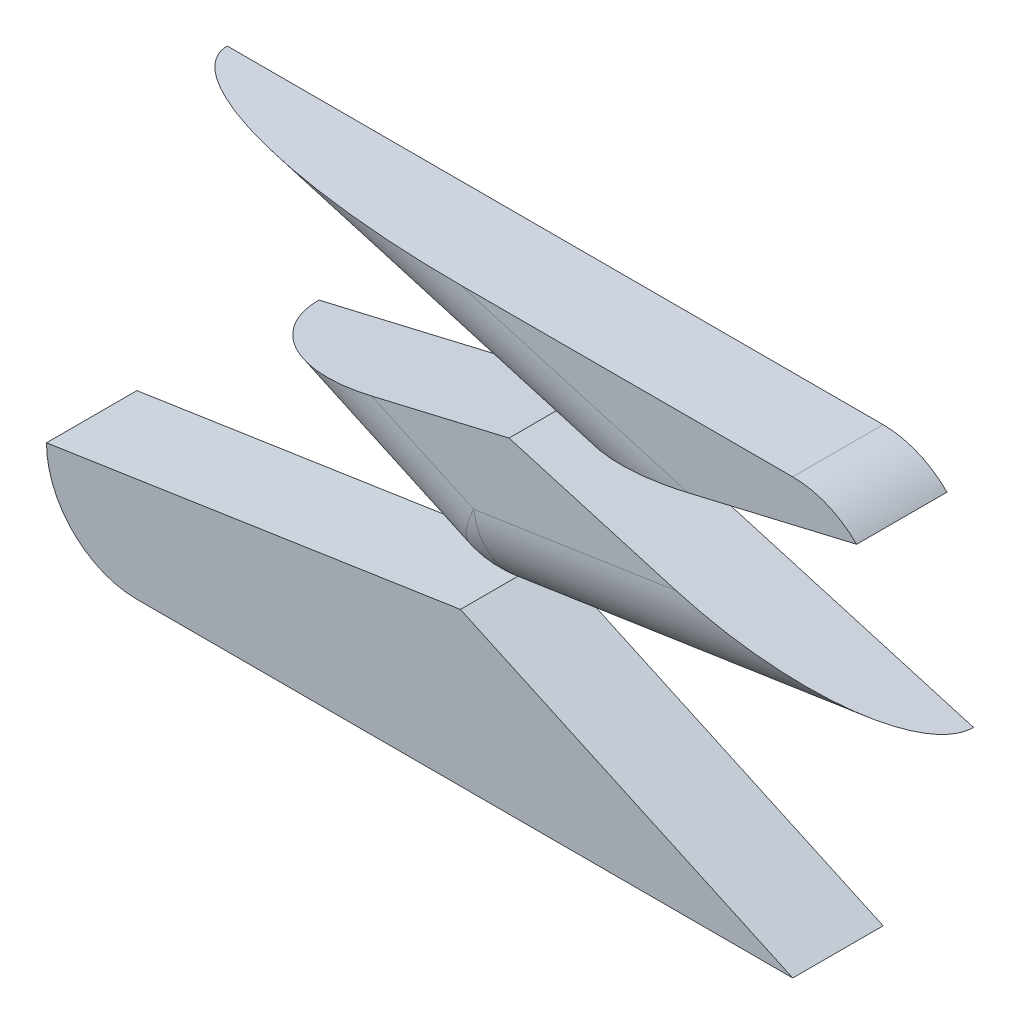
ISO-10303-21;
HEADER;
FILE_DESCRIPTION(('STEP AP214'),'2;1');
FILE_NAME('part.step','',(''),(''),'','','');
FILE_SCHEMA(('AUTOMOTIVE_DESIGN { 1 0 10303 214 1 1 1 1 }'));
ENDSEC;
DATA;
#1=APPLICATION_CONTEXT('core data for automotive mechanical design processes');
#2=APPLICATION_PROTOCOL_DEFINITION('international standard','automotive_design',2000,#1);
#3=PRODUCT_CONTEXT('',#1,'mechanical');
#4=PRODUCT('Part','Part','',(#3));
#5=PRODUCT_RELATED_PRODUCT_CATEGORY('part','',(#4));
#6=PRODUCT_DEFINITION_FORMATION('','',#4);
#7=PRODUCT_DEFINITION_CONTEXT('part definition',#1,'design');
#8=PRODUCT_DEFINITION('design','',#6,#7);
#9=PRODUCT_DEFINITION_SHAPE('','',#8);
#10=(LENGTH_UNIT() NAMED_UNIT(*) SI_UNIT(.MILLI.,.METRE.));
#11=(NAMED_UNIT(*) PLANE_ANGLE_UNIT() SI_UNIT($,.RADIAN.));
#12=(NAMED_UNIT(*) SI_UNIT($,.STERADIAN.) SOLID_ANGLE_UNIT());
#13=UNCERTAINTY_MEASURE_WITH_UNIT(LENGTH_MEASURE(1.E-05),#10,'distance_accuracy_value','');
#14=(GEOMETRIC_REPRESENTATION_CONTEXT(3) GLOBAL_UNCERTAINTY_ASSIGNED_CONTEXT((#13)) GLOBAL_UNIT_ASSIGNED_CONTEXT((#10,
#11,#12)) REPRESENTATION_CONTEXT('',''));
#15=CARTESIAN_POINT('',(0.,0.,0.));
#16=DIRECTION('',(0.,0.,1.));
#17=DIRECTION('',(1.,0.,0.));
#18=AXIS2_PLACEMENT_3D('',#15,#16,#17);
#19=CARTESIAN_POINT('',(14.0864731957978,11.838912938109,10.));
#20=DIRECTION('',(0.,0.,-1.));
#21=DIRECTION('',(-1.,0.,0.));
#22=AXIS2_PLACEMENT_3D('',#19,#20,#21);
#23=CYLINDRICAL_SURFACE('',#22,10.);
#24=CARTESIAN_POINT('',(14.0864731957978,11.838912938109,0.));
#25=DIRECTION('',(0.,0.,1.));
#26=DIRECTION('',(1.,0.,0.));
#27=AXIS2_PLACEMENT_3D('',#24,#25,#26);
#28=CIRCLE('',#27,10.);
#29=CARTESIAN_POINT('',(14.0864731957979,1.83891293810901,0.));
#30=VERTEX_POINT('',#29);
#31=CARTESIAN_POINT('',(4.0864731957978,11.8389129381091,0.));
#32=VERTEX_POINT('',#31);
#33=EDGE_CURVE('E119',#30,#32,#28,.F.);
#34=ORIENTED_EDGE('',*,*,#33,.F.);
#35=DIRECTION('',(0.,0.,-1.));
#36=VECTOR('',#35,1.);
#37=CARTESIAN_POINT('',(14.0864731957979,1.83891293810901,10.));
#38=LINE('',#37,#36);
#39=CARTESIAN_POINT('',(14.0864731957979,1.83891293810901,10.));
#40=VERTEX_POINT('',#39);
#41=EDGE_CURVE('E12',#40,#30,#38,.T.);
#42=ORIENTED_EDGE('',*,*,#41,.F.);
#43=CARTESIAN_POINT('',(14.0864731957978,11.838912938109,10.));
#44=DIRECTION('',(0.,0.,1.));
#45=DIRECTION('',(1.,0.,0.));
#46=AXIS2_PLACEMENT_3D('',#43,#44,#45);
#47=CIRCLE('',#46,10.);
#48=CARTESIAN_POINT('',(4.0864731957978,11.8389129381091,10.));
#49=VERTEX_POINT('',#48);
#50=EDGE_CURVE('E105',#40,#49,#47,.F.);
#51=ORIENTED_EDGE('',*,*,#50,.T.);
#52=DIRECTION('',(0.,0.,-1.));
#53=VECTOR('',#52,1.);
#54=CARTESIAN_POINT('',(4.0864731957978,11.8389129381091,10.));
#55=LINE('',#54,#53);
#56=EDGE_CURVE('E69',#49,#32,#55,.T.);
#57=ORIENTED_EDGE('',*,*,#56,.T.);
#58=EDGE_LOOP('',(#34,#42,#51,#57));
#59=FACE_BOUND('',#58,.T.);
#60=ADVANCED_FACE('F53',(#59),#23,.T.);
#61=CARTESIAN_POINT('',(0.,1.83891293810901,10.));
#62=DIRECTION('',(0.,1.,0.));
#63=DIRECTION('',(0.,0.,1.));
#64=AXIS2_PLACEMENT_3D('',#61,#62,#63);
#65=PLANE('',#64);
#66=DIRECTION('',(1.,0.,0.));
#67=VECTOR('',#66,1.);
#68=CARTESIAN_POINT('',(0.,1.83891293810901,0.));
#69=LINE('',#68,#67);
#70=CARTESIAN_POINT('',(86.6450910806178,1.83891293810901,0.));
#71=VERTEX_POINT('',#70);
#72=EDGE_CURVE('E107',#30,#71,#69,.T.);
#73=ORIENTED_EDGE('',*,*,#72,.T.);
#74=DIRECTION('',(0.,0.,-1.));
#75=VECTOR('',#74,1.);
#76=CARTESIAN_POINT('',(86.6450910806178,1.83891293810901,10.));
#77=LINE('',#76,#75);
#78=CARTESIAN_POINT('',(86.6450910806178,1.83891293810901,10.));
#79=VERTEX_POINT('',#78);
#80=EDGE_CURVE('E64',#79,#71,#77,.T.);
#81=ORIENTED_EDGE('',*,*,#80,.F.);
#82=DIRECTION('',(1.,0.,0.));
#83=VECTOR('',#82,1.);
#84=CARTESIAN_POINT('',(0.,1.83891293810901,10.));
#85=LINE('',#84,#83);
#86=EDGE_CURVE('E96',#40,#79,#85,.T.);
#87=ORIENTED_EDGE('',*,*,#86,.F.);
#88=ORIENTED_EDGE('',*,*,#41,.T.);
#89=EDGE_LOOP('',(#73,#81,#87,#88));
#90=FACE_BOUND('',#89,.T.);
#91=ADVANCED_FACE('F106',(#90),#65,.F.);
#92=CARTESIAN_POINT('',(15.8564941028141,34.4351896510022,10.));
#93=DIRECTION('',(0.418260594793118,0.908327074815733,0.));
#94=DIRECTION('',(-0.908327074815733,0.418260594793118,0.));
#95=AXIS2_PLACEMENT_3D('',#92,#93,#94);
#96=PLANE('',#95);
#97=DIRECTION('',(0.908327074815734,-0.418260594793118,0.));
#98=VECTOR('',#97,1.);
#99=CARTESIAN_POINT('',(15.8564941028141,34.4351896510022,0.));
#100=LINE('',#99,#98);
#101=CARTESIAN_POINT('',(49.8781308796075,18.7691257092401,0.));
#102=VERTEX_POINT('',#101);
#103=EDGE_CURVE('E118',#102,#71,#100,.T.);
#104=ORIENTED_EDGE('',*,*,#103,.F.);
#105=DIRECTION('',(0.,0.,-1.));
#106=VECTOR('',#105,1.);
#107=CARTESIAN_POINT('',(49.8781308796075,18.7691257092401,10.));
#108=LINE('',#107,#106);
#109=CARTESIAN_POINT('',(49.8781308796075,18.7691257092401,10.));
#110=VERTEX_POINT('',#109);
#111=EDGE_CURVE('E82',#110,#102,#108,.T.);
#112=ORIENTED_EDGE('',*,*,#111,.F.);
#113=DIRECTION('',(0.908327074815734,-0.418260594793118,0.));
#114=VECTOR('',#113,1.);
#115=CARTESIAN_POINT('',(15.8564941028141,34.4351896510022,10.));
#116=LINE('',#115,#114);
#117=EDGE_CURVE('E101',#110,#79,#116,.T.);
#118=ORIENTED_EDGE('',*,*,#117,.T.);
#119=ORIENTED_EDGE('',*,*,#80,.T.);
#120=EDGE_LOOP('',(#104,#112,#118,#119));
#121=FACE_BOUND('',#120,.T.);
#122=ADVANCED_FACE('F112',(#121),#96,.T.);
#123=CARTESIAN_POINT('',(-1.66010540498889,10.9692127694786,10.));
#124=DIRECTION('',(-0.149638264627068,0.988740810202249,0.));
#125=DIRECTION('',(-0.988740810202249,-0.149638264627068,0.));
#126=AXIS2_PLACEMENT_3D('',#123,#124,#125);
#127=PLANE('',#126);
#128=DIRECTION('',(0.988740810202249,0.149638264627068,0.));
#129=VECTOR('',#128,1.);
#130=CARTESIAN_POINT('',(-1.66010540498889,10.9692127694786,0.));
#131=LINE('',#130,#129);
#132=EDGE_CURVE('E125',#32,#102,#131,.T.);
#133=ORIENTED_EDGE('',*,*,#132,.F.);
#134=ORIENTED_EDGE('',*,*,#56,.F.);
#135=DIRECTION('',(0.988740810202249,0.149638264627068,0.));
#136=VECTOR('',#135,1.);
#137=CARTESIAN_POINT('',(-1.66010540498889,10.9692127694786,10.));
#138=LINE('',#137,#136);
#139=EDGE_CURVE('E115',#49,#110,#138,.T.);
#140=ORIENTED_EDGE('',*,*,#139,.T.);
#141=ORIENTED_EDGE('',*,*,#111,.T.);
#142=EDGE_LOOP('',(#133,#134,#140,#141));
#143=FACE_BOUND('',#142,.T.);
#144=ADVANCED_FACE('F130',(#143),#127,.T.);
#145=CARTESIAN_POINT('',(0.,0.,10.));
#146=DIRECTION('',(0.,0.,1.));
#147=DIRECTION('',(1.,0.,0.));
#148=AXIS2_PLACEMENT_3D('',#145,#146,#147);
#149=PLANE('',#148);
#150=ORIENTED_EDGE('',*,*,#50,.F.);
#151=ORIENTED_EDGE('',*,*,#86,.T.);
#152=ORIENTED_EDGE('',*,*,#117,.F.);
#153=ORIENTED_EDGE('',*,*,#139,.F.);
#154=EDGE_LOOP('',(#150,#151,#152,#153));
#155=FACE_BOUND('',#154,.T.);
#156=ADVANCED_FACE('F98',(#155),#149,.T.);
#157=CARTESIAN_POINT('',(0.,0.,0.));
#158=DIRECTION('',(0.,0.,1.));
#159=DIRECTION('',(1.,0.,0.));
#160=AXIS2_PLACEMENT_3D('',#157,#158,#159);
#161=PLANE('',#160);
#162=ORIENTED_EDGE('',*,*,#33,.T.);
#163=ORIENTED_EDGE('',*,*,#132,.T.);
#164=ORIENTED_EDGE('',*,*,#103,.T.);
#165=ORIENTED_EDGE('',*,*,#72,.F.);
#166=EDGE_LOOP('',(#162,#163,#164,#165));
#167=FACE_BOUND('',#166,.T.);
#168=ADVANCED_FACE('F131',(#167),#161,.F.);
#169=CLOSED_SHELL('',(#60,#91,#122,#144,#156,#168));
#170=MANIFOLD_SOLID_BREP('B2',#169);
#171=CARTESIAN_POINT('',(86.6450910806178,39.8549729887331,10.));
#172=DIRECTION('',(0.,0.,-1.));
#173=DIRECTION('',(-1.,0.,0.));
#174=AXIS2_PLACEMENT_3D('',#171,#172,#173);
#175=CYLINDRICAL_SURFACE('',#174,10.);
#176=CARTESIAN_POINT('',(86.6450910806178,39.8549729887331,0.));
#177=DIRECTION('',(0.,0.,1.));
#178=DIRECTION('',(1.,0.,0.));
#179=AXIS2_PLACEMENT_3D('',#176,#177,#178);
#180=CIRCLE('',#179,10.);
#181=CARTESIAN_POINT('',(86.6450910806178,49.8549729887331,0.));
#182=VERTEX_POINT('',#181);
#183=CARTESIAN_POINT('',(93.7161588924833,46.9260408005986,0.));
#184=VERTEX_POINT('',#183);
#185=EDGE_CURVE('E240',#182,#184,#180,.F.);
#186=ORIENTED_EDGE('',*,*,#185,.F.);
#187=DIRECTION('',(0.,0.,-1.));
#188=VECTOR('',#187,1.);
#189=CARTESIAN_POINT('',(86.6450910806178,49.8549729887331,10.));
#190=LINE('',#189,#188);
#191=CARTESIAN_POINT('',(86.6450910806178,49.8549729887331,10.));
#192=VERTEX_POINT('',#191);
#193=EDGE_CURVE('E229',#192,#182,#190,.T.);
#194=ORIENTED_EDGE('',*,*,#193,.F.);
#195=CARTESIAN_POINT('',(86.6450910806178,39.8549729887331,10.));
#196=DIRECTION('',(0.,0.,1.));
#197=DIRECTION('',(1.,0.,0.));
#198=AXIS2_PLACEMENT_3D('',#195,#196,#197);
#199=CIRCLE('',#198,10.);
#200=CARTESIAN_POINT('',(93.7161588924833,46.9260408005986,10.));
#201=VERTEX_POINT('',#200);
#202=EDGE_CURVE('E235',#192,#201,#199,.F.);
#203=ORIENTED_EDGE('',*,*,#202,.T.);
#204=DIRECTION('',(0.,0.,-1.));
#205=VECTOR('',#204,1.);
#206=CARTESIAN_POINT('',(93.7161588924833,46.9260408005986,10.));
#207=LINE('',#206,#205);
#208=EDGE_CURVE('E238',#201,#184,#207,.T.);
#209=ORIENTED_EDGE('',*,*,#208,.T.);
#210=EDGE_LOOP('',(#186,#194,#203,#209));
#211=FACE_BOUND('',#210,.T.);
#212=ADVANCED_FACE('F189',(#211),#175,.T.);
#213=CARTESIAN_POINT('',(0.,49.8549729887331,10.));
#214=DIRECTION('',(0.,1.,0.));
#215=DIRECTION('',(0.,0.,1.));
#216=AXIS2_PLACEMENT_3D('',#213,#214,#215);
#217=PLANE('',#216);
#218=DIRECTION('',(1.,0.,0.));
#219=VECTOR('',#218,1.);
#220=CARTESIAN_POINT('',(0.,49.8549729887331,0.));
#221=LINE('',#220,#219);
#222=CARTESIAN_POINT('',(14.0864731957979,49.8549729887331,0.));
#223=VERTEX_POINT('',#222);
#224=EDGE_CURVE('E251',#223,#182,#221,.T.);
#225=ORIENTED_EDGE('',*,*,#224,.F.);
#226=CARTESIAN_POINT('',(49.8988863492792,49.8549729887331,0.));
#227=DIRECTION('',(0.,1.,0.));
#228=DIRECTION('',(-1.,0.,0.));
#229=AXIS2_PLACEMENT_3D('',#226,#227,#228);
#230=ELLIPSE('',#229,35.8124131534813,10.);
#231=CARTESIAN_POINT('',(49.8988863492792,49.8549729887331,10.));
#232=VERTEX_POINT('',#231);
#233=EDGE_CURVE('E55',#223,#232,#230,.T.);
#234=ORIENTED_EDGE('',*,*,#233,.T.);
#235=DIRECTION('',(1.,0.,0.));
#236=VECTOR('',#235,1.);
#237=CARTESIAN_POINT('',(0.,49.8549729887331,10.));
#238=LINE('',#237,#236);
#239=EDGE_CURVE('E221',#232,#192,#238,.T.);
#240=ORIENTED_EDGE('',*,*,#239,.T.);
#241=ORIENTED_EDGE('',*,*,#193,.T.);
#242=EDGE_LOOP('',(#225,#234,#240,#241));
#243=FACE_BOUND('',#242,.T.);
#244=ADVANCED_FACE('F227',(#243),#217,.T.);
#245=CARTESIAN_POINT('',(-5.54591729924884,23.5815986182663,10.));
#246=DIRECTION('',(-0.228933953149476,0.973441957743426,0.));
#247=DIRECTION('',(-0.973441957743426,-0.228933953149476,0.));
#248=AXIS2_PLACEMENT_3D('',#245,#246,#247);
#249=PLANE('',#248);
#250=DIRECTION('',(0.973441957743426,0.228933953149476,0.));
#251=VECTOR('',#250,1.);
#252=CARTESIAN_POINT('',(-5.54591729924884,23.5815986182663,10.));
#253=LINE('',#252,#251);
#254=CARTESIAN_POINT('',(75.0593122475362,42.5383260305957,10.));
#255=VERTEX_POINT('',#254);
#256=EDGE_CURVE('E231',#255,#201,#253,.T.);
#257=ORIENTED_EDGE('',*,*,#256,.F.);
#258=CARTESIAN_POINT('',(75.0593122475362,42.5383260305957,0.));
#259=DIRECTION('',(-0.228933953149476,0.973441957743426,0.));
#260=DIRECTION('',(-0.973441957743426,-0.228933953149476,0.));
#261=AXIS2_PLACEMENT_3D('',#258,#259,#260);
#262=ELLIPSE('',#261,20.3398934483914,10.);
#263=CARTESIAN_POINT('',(55.2596065488413,37.8818338168163,0.));
#264=VERTEX_POINT('',#263);
#265=EDGE_CURVE('E194',#255,#264,#262,.F.);
#266=ORIENTED_EDGE('',*,*,#265,.T.);
#267=DIRECTION('',(0.973441957743426,0.228933953149476,0.));
#268=VECTOR('',#267,1.);
#269=CARTESIAN_POINT('',(-5.54591729924884,23.5815986182663,0.));
#270=LINE('',#269,#268);
#271=EDGE_CURVE('E243',#264,#184,#270,.T.);
#272=ORIENTED_EDGE('',*,*,#271,.T.);
#273=ORIENTED_EDGE('',*,*,#208,.F.);
#274=EDGE_LOOP('',(#257,#266,#272,#273));
#275=FACE_BOUND('',#274,.T.);
#276=ADVANCED_FACE('F259',(#275),#249,.F.);
#277=CARTESIAN_POINT('',(0.,0.,10.));
#278=DIRECTION('',(0.,0.,1.));
#279=DIRECTION('',(1.,0.,0.));
#280=AXIS2_PLACEMENT_3D('',#277,#278,#279);
#281=PLANE('',#280);
#282=ORIENTED_EDGE('',*,*,#239,.F.);
#283=DIRECTION('',(0.960223437349689,-0.279232788841762,0.));
#284=VECTOR('',#283,1.);
#285=CARTESIAN_POINT('',(58.051934437259,47.4840681903132,10.));
#286=LINE('',#285,#284);
#287=EDGE_CURVE('E239',#232,#255,#286,.T.);
#288=ORIENTED_EDGE('',*,*,#287,.T.);
#289=ORIENTED_EDGE('',*,*,#256,.T.);
#290=ORIENTED_EDGE('',*,*,#202,.F.);
#291=EDGE_LOOP('',(#282,#288,#289,#290));
#292=FACE_BOUND('',#291,.T.);
#293=ADVANCED_FACE('F244',(#292),#281,.T.);
#294=CARTESIAN_POINT('',(0.,0.,0.));
#295=DIRECTION('',(0.,0.,1.));
#296=DIRECTION('',(1.,0.,0.));
#297=AXIS2_PLACEMENT_3D('',#294,#295,#296);
#298=PLANE('',#297);
#299=ORIENTED_EDGE('',*,*,#185,.T.);
#300=ORIENTED_EDGE('',*,*,#271,.F.);
#301=DIRECTION('',(0.960223437349689,-0.279232788841762,0.));
#302=VECTOR('',#301,1.);
#303=CARTESIAN_POINT('',(14.465743625151,49.7446812216359,0.));
#304=LINE('',#303,#302);
#305=EDGE_CURVE('E247',#223,#264,#304,.T.);
#306=ORIENTED_EDGE('',*,*,#305,.F.);
#307=ORIENTED_EDGE('',*,*,#224,.T.);
#308=EDGE_LOOP('',(#299,#300,#306,#307));
#309=FACE_BOUND('',#308,.T.);
#310=ADVANCED_FACE('F261',(#309),#298,.F.);
#311=CARTESIAN_POINT('',(17.2580715135686,59.3469155951327,0.));
#312=DIRECTION('',(-0.960223437349689,0.279232788841762,0.));
#313=DIRECTION('',(-0.279232788841762,-0.960223437349689,0.));
#314=AXIS2_PLACEMENT_3D('',#311,#312,#313);
#315=CYLINDRICAL_SURFACE('',#314,10.);
#316=ORIENTED_EDGE('',*,*,#233,.F.);
#317=ORIENTED_EDGE('',*,*,#305,.T.);
#318=ORIENTED_EDGE('',*,*,#265,.F.);
#319=ORIENTED_EDGE('',*,*,#287,.F.);
#320=EDGE_LOOP('',(#316,#317,#318,#319));
#321=FACE_BOUND('',#320,.T.);
#322=ADVANCED_FACE('F186',(#321),#315,.T.);
#323=CLOSED_SHELL('',(#212,#244,#276,#293,#310,#322));
#324=MANIFOLD_SOLID_BREP('B6',#323);
#325=CARTESIAN_POINT('',(-5.54591729924884,23.5815986182663,10.));
#326=DIRECTION('',(-0.228933953149476,0.973441957743426,0.));
#327=DIRECTION('',(-0.973441957743426,-0.228933953149476,0.));
#328=AXIS2_PLACEMENT_3D('',#325,#326,#327);
#329=PLANE('',#328);
#330=DIRECTION('',(0.973441957743426,0.228933953149476,0.));
#331=VECTOR('',#330,1.);
#332=CARTESIAN_POINT('',(-5.54591729924884,23.5815986182663,0.));
#333=LINE('',#332,#331);
#334=CARTESIAN_POINT('',(24.222980218786,30.5826440688895,0.));
#335=VERTEX_POINT('',#334);
#336=CARTESIAN_POINT('',(55.2596065488413,37.8818338168163,0.));
#337=VERTEX_POINT('',#336);
#338=EDGE_CURVE('E374',#335,#337,#333,.T.);
#339=ORIENTED_EDGE('',*,*,#338,.F.);
#340=CARTESIAN_POINT('',(40.0487489316388,34.3045462986448,0.));
#341=DIRECTION('',(-0.228933953149476,0.973441957743426,0.));
#342=DIRECTION('',(-0.973441957743426,-0.228933953149476,0.));
#343=AXIS2_PLACEMENT_3D('',#340,#341,#342);
#344=ELLIPSE('',#343,16.2575370693279,10.);
#345=CARTESIAN_POINT('',(40.0487489316388,34.3045462986448,10.));
#346=VERTEX_POINT('',#345);
#347=EDGE_CURVE('E183',#335,#346,#344,.T.);
#348=ORIENTED_EDGE('',*,*,#347,.T.);
#349=DIRECTION('',(0.973441957743426,0.228933953149476,0.));
#350=VECTOR('',#349,1.);
#351=CARTESIAN_POINT('',(-5.54591729924884,23.5815986182663,10.));
#352=LINE('',#351,#350);
#353=CARTESIAN_POINT('',(55.2596065488413,37.8818338168163,10.));
#354=VERTEX_POINT('',#353);
#355=EDGE_CURVE('E354',#346,#354,#352,.T.);
#356=ORIENTED_EDGE('',*,*,#355,.T.);
#357=DIRECTION('',(0.,0.,-1.));
#358=VECTOR('',#357,1.);
#359=CARTESIAN_POINT('',(55.2596065488413,37.8818338168163,10.));
#360=LINE('',#359,#358);
#361=EDGE_CURVE('E351',#354,#337,#360,.T.);
#362=ORIENTED_EDGE('',*,*,#361,.T.);
#363=EDGE_LOOP('',(#339,#348,#356,#362));
#364=FACE_BOUND('',#363,.T.);
#365=ADVANCED_FACE('F313',(#364),#329,.T.);
#366=CARTESIAN_POINT('',(14.465743625151,49.7446812216359,10.));
#367=DIRECTION('',(0.279232788841762,0.960223437349689,0.));
#368=DIRECTION('',(-0.960223437349689,0.279232788841762,0.));
#369=AXIS2_PLACEMENT_3D('',#366,#367,#368);
#370=PLANE('',#369);
#371=DIRECTION('',(0.960223437349689,-0.279232788841762,0.));
#372=VECTOR('',#371,1.);
#373=CARTESIAN_POINT('',(14.465743625151,49.7446812216359,10.));
#374=LINE('',#373,#372);
#375=CARTESIAN_POINT('',(73.7703752104842,32.4989058898938,10.));
#376=VERTEX_POINT('',#375);
#377=EDGE_CURVE('E358',#354,#376,#374,.T.);
#378=ORIENTED_EDGE('',*,*,#377,.T.);
#379=CARTESIAN_POINT('',(73.7703752104842,32.4989058898938,0.));
#380=DIRECTION('',(0.279232788841762,0.960223437349689,0.));
#381=DIRECTION('',(-0.960223437349689,0.279232788841762,0.));
#382=AXIS2_PLACEMENT_3D('',#379,#380,#381);
#383=ELLIPSE('',#382,23.8222844604482,10.);
#384=CARTESIAN_POINT('',(96.6450910806178,25.846942963421,0.));
#385=VERTEX_POINT('',#384);
#386=EDGE_CURVE('E382',#376,#385,#383,.T.);
#387=ORIENTED_EDGE('',*,*,#386,.T.);
#388=DIRECTION('',(0.960223437349689,-0.279232788841762,0.));
#389=VECTOR('',#388,1.);
#390=CARTESIAN_POINT('',(14.465743625151,49.7446812216359,0.));
#391=LINE('',#390,#389);
#392=EDGE_CURVE('E359',#337,#385,#391,.T.);
#393=ORIENTED_EDGE('',*,*,#392,.F.);
#394=ORIENTED_EDGE('',*,*,#361,.F.);
#395=EDGE_LOOP('',(#378,#387,#393,#394));
#396=FACE_BOUND('',#395,.T.);
#397=ADVANCED_FACE('F364',(#396),#370,.T.);
#398=CARTESIAN_POINT('',(0.,0.,10.));
#399=DIRECTION('',(0.,0.,1.));
#400=DIRECTION('',(1.,0.,0.));
#401=AXIS2_PLACEMENT_3D('',#398,#399,#400);
#402=PLANE('',#401);
#403=ORIENTED_EDGE('',*,*,#355,.F.);
#404=DIRECTION('',(0.908327074815733,-0.418260594793118,0.));
#405=VECTOR('',#404,1.);
#406=CARTESIAN_POINT('',(37.5298236128767,35.4644447881604,10.));
#407=LINE('',#406,#405);
#408=CARTESIAN_POINT('',(51.3416042448718,29.10448509692,10.));
#409=VERTEX_POINT('',#408);
#410=EDGE_CURVE('E319',#346,#409,#407,.T.);
#411=ORIENTED_EDGE('',*,*,#410,.T.);
#412=DIRECTION('',(0.988740810202249,0.149638264627068,0.));
#413=VECTOR('',#412,1.);
#414=CARTESIAN_POINT('',(95.1487084343472,35.7343510654435,10.));
#415=LINE('',#414,#413);
#416=EDGE_CURVE('E366',#409,#376,#415,.T.);
#417=ORIENTED_EDGE('',*,*,#416,.T.);
#418=ORIENTED_EDGE('',*,*,#377,.F.);
#419=EDGE_LOOP('',(#403,#411,#417,#418));
#420=FACE_BOUND('',#419,.T.);
#421=ADVANCED_FACE('F367',(#420),#402,.T.);
#422=CARTESIAN_POINT('',(0.,0.,0.));
#423=DIRECTION('',(0.,0.,1.));
#424=DIRECTION('',(1.,0.,0.));
#425=AXIS2_PLACEMENT_3D('',#422,#423,#424);
#426=PLANE('',#425);
#427=DIRECTION('',(0.988740810202249,0.149638264627068,0.));
#428=VECTOR('',#427,1.);
#429=CARTESIAN_POINT('',(-1.66010540498889,10.9692127694786,0.));
#430=LINE('',#429,#428);
#431=CARTESIAN_POINT('',(52.8379868911425,19.2170769948975,0.));
#432=VERTEX_POINT('',#431);
#433=EDGE_CURVE('E377',#432,#385,#430,.T.);
#434=ORIENTED_EDGE('',*,*,#433,.F.);
#435=CARTESIAN_POINT('',(51.3416042448719,29.10448509692,0.));
#436=DIRECTION('',(0.,0.,1.));
#437=DIRECTION('',(1.,0.,0.));
#438=AXIS2_PLACEMENT_3D('',#435,#436,#437);
#439=CIRCLE('',#438,10.);
#440=CARTESIAN_POINT('',(47.1589982969407,20.0212143487627,0.));
#441=VERTEX_POINT('',#440);
#442=EDGE_CURVE('E334',#432,#441,#439,.F.);
#443=ORIENTED_EDGE('',*,*,#442,.T.);
#444=DIRECTION('',(0.908327074815734,-0.418260594793118,0.));
#445=VECTOR('',#444,1.);
#446=CARTESIAN_POINT('',(15.8564941028141,34.4351896510022,0.));
#447=LINE('',#446,#445);
#448=EDGE_CURVE('E380',#335,#441,#447,.T.);
#449=ORIENTED_EDGE('',*,*,#448,.F.);
#450=ORIENTED_EDGE('',*,*,#338,.T.);
#451=ORIENTED_EDGE('',*,*,#392,.T.);
#452=EDGE_LOOP('',(#434,#443,#449,#450,#451));
#453=FACE_BOUND('',#452,.T.);
#454=ADVANCED_FACE('F400',(#453),#426,.F.);
#455=CARTESIAN_POINT('',(-3.15648805125957,20.8566208715011,0.));
#456=DIRECTION('',(-0.988740810202249,-0.149638264627068,0.));
#457=DIRECTION('',(0.149638264627068,-0.988740810202249,0.));
#458=AXIS2_PLACEMENT_3D('',#455,#456,#457);
#459=CYLINDRICAL_SURFACE('',#458,10.);
#460=ORIENTED_EDGE('',*,*,#416,.F.);
#461=CARTESIAN_POINT('',(51.3416042448719,29.10448509692,0.));
#462=DIRECTION('',(-0.988740810202249,-0.149638264627068,0.));
#463=DIRECTION('',(0.149638264627068,-0.988740810202249,0.));
#464=AXIS2_PLACEMENT_3D('',#461,#462,#463);
#465=CIRCLE('',#464,10.);
#466=EDGE_CURVE('E384',#409,#432,#465,.F.);
#467=ORIENTED_EDGE('',*,*,#466,.T.);
#468=ORIENTED_EDGE('',*,*,#433,.T.);
#469=ORIENTED_EDGE('',*,*,#386,.F.);
#470=EDGE_LOOP('',(#460,#467,#468,#469));
#471=FACE_BOUND('',#470,.T.);
#472=ADVANCED_FACE('F395',(#471),#459,.T.);
#473=CARTESIAN_POINT('',(20.0391000507452,43.5184603991596,0.));
#474=DIRECTION('',(-0.908327074815733,0.418260594793118,0.));
#475=DIRECTION('',(-0.418260594793118,-0.908327074815733,0.));
#476=AXIS2_PLACEMENT_3D('',#473,#474,#475);
#477=CYLINDRICAL_SURFACE('',#476,10.);
#478=ORIENTED_EDGE('',*,*,#347,.F.);
#479=ORIENTED_EDGE('',*,*,#448,.T.);
#480=CARTESIAN_POINT('',(51.3416042448719,29.10448509692,0.));
#481=DIRECTION('',(0.908327074815733,-0.418260594793119,0.));
#482=DIRECTION('',(0.418260594793119,0.908327074815733,0.));
#483=AXIS2_PLACEMENT_3D('',#480,#481,#482);
#484=CIRCLE('',#483,10.);
#485=EDGE_CURVE('E312',#409,#441,#484,.T.);
#486=ORIENTED_EDGE('',*,*,#485,.F.);
#487=ORIENTED_EDGE('',*,*,#410,.F.);
#488=EDGE_LOOP('',(#478,#479,#486,#487));
#489=FACE_BOUND('',#488,.T.);
#490=ADVANCED_FACE('F311',(#489),#477,.T.);
#491=CARTESIAN_POINT('',(51.3416042448719,29.10448509692,0.));
#492=DIRECTION('',(0.418260594793118,0.908327074815733,0.));
#493=DIRECTION('',(-0.908327074815733,0.418260594793118,0.));
#494=AXIS2_PLACEMENT_3D('',#491,#492,#493);
#495=SPHERICAL_SURFACE('',#494,10.);
#496=ORIENTED_EDGE('',*,*,#442,.F.);
#497=ORIENTED_EDGE('',*,*,#466,.F.);
#498=ORIENTED_EDGE('',*,*,#485,.T.);
#499=EDGE_LOOP('',(#496,#497,#498));
#500=FACE_BOUND('',#499,.T.);
#501=ADVANCED_FACE('F396',(#500),#495,.T.);
#502=CLOSED_SHELL('',(#365,#397,#421,#454,#472,#490,#501));
#503=MANIFOLD_SOLID_BREP('B46',#502);
#504=ADVANCED_BREP_SHAPE_REPRESENTATION('',(#18,#170,#324,#503),#14);
#505=SHAPE_DEFINITION_REPRESENTATION(#9,#504);
ENDSEC;
END-ISO-10303-21;
